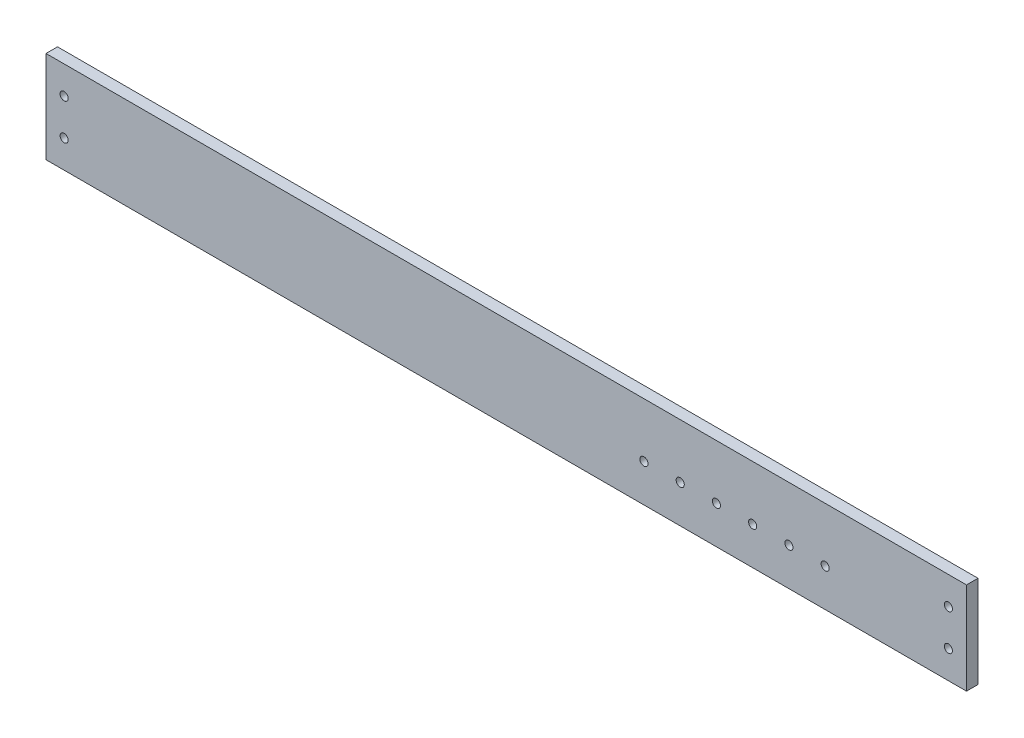
ISO-10303-21;
HEADER;
FILE_DESCRIPTION(('STEP AP214'),'2;1');
FILE_NAME('part.step','',(''),(''),'','','');
FILE_SCHEMA(('AUTOMOTIVE_DESIGN { 1 0 10303 214 1 1 1 1 }'));
ENDSEC;
DATA;
#1=APPLICATION_CONTEXT('core data for automotive mechanical design processes');
#2=APPLICATION_PROTOCOL_DEFINITION('international standard','automotive_design',2000,#1);
#3=PRODUCT_CONTEXT('',#1,'mechanical');
#4=PRODUCT('Part','Part','',(#3));
#5=PRODUCT_RELATED_PRODUCT_CATEGORY('part','',(#4));
#6=PRODUCT_DEFINITION_FORMATION('','',#4);
#7=PRODUCT_DEFINITION_CONTEXT('part definition',#1,'design');
#8=PRODUCT_DEFINITION('design','',#6,#7);
#9=PRODUCT_DEFINITION_SHAPE('','',#8);
#10=(LENGTH_UNIT() NAMED_UNIT(*) SI_UNIT(.MILLI.,.METRE.));
#11=(NAMED_UNIT(*) PLANE_ANGLE_UNIT() SI_UNIT($,.RADIAN.));
#12=(NAMED_UNIT(*) SI_UNIT($,.STERADIAN.) SOLID_ANGLE_UNIT());
#13=UNCERTAINTY_MEASURE_WITH_UNIT(LENGTH_MEASURE(1.E-05),#10,'distance_accuracy_value','');
#14=(GEOMETRIC_REPRESENTATION_CONTEXT(3) GLOBAL_UNCERTAINTY_ASSIGNED_CONTEXT((#13)) GLOBAL_UNIT_ASSIGNED_CONTEXT((#10,
#11,#12)) REPRESENTATION_CONTEXT('',''));
#15=CARTESIAN_POINT('',(0.,0.,0.));
#16=DIRECTION('',(0.,0.,1.));
#17=DIRECTION('',(1.,0.,0.));
#18=AXIS2_PLACEMENT_3D('',#15,#16,#17);
#19=CARTESIAN_POINT('',(0.,0.,3.175));
#20=DIRECTION('',(0.,0.,-1.));
#21=DIRECTION('',(-1.,0.,0.));
#22=AXIS2_PLACEMENT_3D('',#19,#20,#21);
#23=PLANE('',#22);
#24=DIRECTION('',(-1.,0.,0.));
#25=VECTOR('',#24,1.);
#26=CARTESIAN_POINT('',(-144.549090909091,66.7327272727273,3.175));
#27=LINE('',#26,#25);
#28=CARTESIAN_POINT('',(109.450909090909,66.7327272727274,3.175));
#29=VERTEX_POINT('',#28);
#30=CARTESIAN_POINT('',(-144.549090909091,66.7327272727273,3.175));
#31=VERTEX_POINT('',#30);
#32=EDGE_CURVE('E85',#29,#31,#27,.T.);
#33=ORIENTED_EDGE('',*,*,#32,.T.);
#34=DIRECTION('',(0.,-1.,0.));
#35=VECTOR('',#34,1.);
#36=CARTESIAN_POINT('',(-144.549090909091,66.7327272727273,3.175));
#37=LINE('',#36,#35);
#38=CARTESIAN_POINT('',(-144.549090909091,41.3327272727273,3.175));
#39=VERTEX_POINT('',#38);
#40=EDGE_CURVE('E80',#31,#39,#37,.T.);
#41=ORIENTED_EDGE('',*,*,#40,.T.);
#42=DIRECTION('',(1.,0.,0.));
#43=VECTOR('',#42,1.);
#44=CARTESIAN_POINT('',(-144.549090909091,41.3327272727273,3.175));
#45=LINE('',#44,#43);
#46=CARTESIAN_POINT('',(109.450909090909,41.3327272727274,3.175));
#47=VERTEX_POINT('',#46);
#48=EDGE_CURVE('E83',#39,#47,#45,.T.);
#49=ORIENTED_EDGE('',*,*,#48,.T.);
#50=DIRECTION('',(0.,1.,0.));
#51=VECTOR('',#50,1.);
#52=CARTESIAN_POINT('',(109.450909090909,66.7327272727274,3.175));
#53=LINE('',#52,#51);
#54=EDGE_CURVE('E50',#47,#29,#53,.T.);
#55=ORIENTED_EDGE('',*,*,#54,.T.);
#56=EDGE_LOOP('',(#33,#41,#49,#55));
#57=FACE_BOUND('',#56,.T.);
#58=CARTESIAN_POINT('',(-139.549090909091,59.0327272727273,3.175));
#59=DIRECTION('',(0.,0.,1.));
#60=DIRECTION('',(1.,0.,0.));
#61=AXIS2_PLACEMENT_3D('',#58,#59,#60);
#62=CIRCLE('',#61,1.12499999999998);
#63=CARTESIAN_POINT('',(-138.424090909091,59.0327272727273,3.175));
#64=VERTEX_POINT('',#63);
#65=EDGE_CURVE('E100',#64,#64,#62,.T.);
#66=ORIENTED_EDGE('',*,*,#65,.F.);
#67=EDGE_LOOP('',(#66));
#68=FACE_BOUND('',#67,.T.);
#69=CARTESIAN_POINT('',(-139.549090909091,49.0327272727273,3.175));
#70=DIRECTION('',(0.,0.,1.));
#71=DIRECTION('',(1.,0.,0.));
#72=AXIS2_PLACEMENT_3D('',#69,#70,#71);
#73=CIRCLE('',#72,1.12499999999998);
#74=CARTESIAN_POINT('',(-138.424090909091,49.0327272727273,3.175));
#75=VERTEX_POINT('',#74);
#76=EDGE_CURVE('E115',#75,#75,#73,.T.);
#77=ORIENTED_EDGE('',*,*,#76,.F.);
#78=EDGE_LOOP('',(#77));
#79=FACE_BOUND('',#78,.T.);
#80=CARTESIAN_POINT('',(104.450909090909,59.0327272727273,3.175));
#81=DIRECTION('',(0.,0.,1.));
#82=DIRECTION('',(1.,0.,0.));
#83=AXIS2_PLACEMENT_3D('',#80,#81,#82);
#84=CIRCLE('',#83,1.12499999999999);
#85=CARTESIAN_POINT('',(105.575909090909,59.0327272727273,3.175));
#86=VERTEX_POINT('',#85);
#87=EDGE_CURVE('E121',#86,#86,#84,.T.);
#88=ORIENTED_EDGE('',*,*,#87,.F.);
#89=EDGE_LOOP('',(#88));
#90=FACE_BOUND('',#89,.T.);
#91=CARTESIAN_POINT('',(104.450909090909,49.0327272727273,3.175));
#92=DIRECTION('',(0.,0.,1.));
#93=DIRECTION('',(1.,0.,0.));
#94=AXIS2_PLACEMENT_3D('',#91,#92,#93);
#95=CIRCLE('',#94,1.125);
#96=CARTESIAN_POINT('',(105.575909090909,49.0327272727273,3.175));
#97=VERTEX_POINT('',#96);
#98=EDGE_CURVE('E127',#97,#97,#95,.T.);
#99=ORIENTED_EDGE('',*,*,#98,.F.);
#100=EDGE_LOOP('',(#99));
#101=FACE_BOUND('',#100,.T.);
#102=CARTESIAN_POINT('',(20.450909090909,51.7327272727274,3.175));
#103=DIRECTION('',(0.,0.,1.));
#104=DIRECTION('',(1.,0.,0.));
#105=AXIS2_PLACEMENT_3D('',#102,#103,#104);
#106=CIRCLE('',#105,1.125);
#107=CARTESIAN_POINT('',(21.575909090909,51.7327272727274,3.175));
#108=VERTEX_POINT('',#107);
#109=EDGE_CURVE('E133',#108,#108,#106,.T.);
#110=ORIENTED_EDGE('',*,*,#109,.F.);
#111=EDGE_LOOP('',(#110));
#112=FACE_BOUND('',#111,.T.);
#113=CARTESIAN_POINT('',(30.4509090909089,51.7327272727274,3.175));
#114=DIRECTION('',(0.,0.,1.));
#115=DIRECTION('',(1.,0.,0.));
#116=AXIS2_PLACEMENT_3D('',#113,#114,#115);
#117=CIRCLE('',#116,1.125);
#118=CARTESIAN_POINT('',(31.575909090909,51.7327272727274,3.175));
#119=VERTEX_POINT('',#118);
#120=EDGE_CURVE('E139',#119,#119,#117,.T.);
#121=ORIENTED_EDGE('',*,*,#120,.F.);
#122=EDGE_LOOP('',(#121));
#123=FACE_BOUND('',#122,.T.);
#124=CARTESIAN_POINT('',(40.4509090909089,51.7327272727274,3.175));
#125=DIRECTION('',(0.,0.,1.));
#126=DIRECTION('',(1.,0.,0.));
#127=AXIS2_PLACEMENT_3D('',#124,#125,#126);
#128=CIRCLE('',#127,1.125);
#129=CARTESIAN_POINT('',(41.5759090909089,51.7327272727274,3.175));
#130=VERTEX_POINT('',#129);
#131=EDGE_CURVE('E145',#130,#130,#128,.T.);
#132=ORIENTED_EDGE('',*,*,#131,.F.);
#133=EDGE_LOOP('',(#132));
#134=FACE_BOUND('',#133,.T.);
#135=CARTESIAN_POINT('',(50.4509090909089,51.7327272727274,3.175));
#136=DIRECTION('',(0.,0.,1.));
#137=DIRECTION('',(1.,0.,0.));
#138=AXIS2_PLACEMENT_3D('',#135,#136,#137);
#139=CIRCLE('',#138,1.125);
#140=CARTESIAN_POINT('',(51.5759090909089,51.7327272727274,3.175));
#141=VERTEX_POINT('',#140);
#142=EDGE_CURVE('E151',#141,#141,#139,.T.);
#143=ORIENTED_EDGE('',*,*,#142,.F.);
#144=EDGE_LOOP('',(#143));
#145=FACE_BOUND('',#144,.T.);
#146=CARTESIAN_POINT('',(60.4509090909089,51.7327272727274,3.175));
#147=DIRECTION('',(0.,0.,1.));
#148=DIRECTION('',(1.,0.,0.));
#149=AXIS2_PLACEMENT_3D('',#146,#147,#148);
#150=CIRCLE('',#149,1.125);
#151=CARTESIAN_POINT('',(61.5759090909089,51.7327272727274,3.175));
#152=VERTEX_POINT('',#151);
#153=EDGE_CURVE('E157',#152,#152,#150,.T.);
#154=ORIENTED_EDGE('',*,*,#153,.F.);
#155=EDGE_LOOP('',(#154));
#156=FACE_BOUND('',#155,.T.);
#157=CARTESIAN_POINT('',(70.4509090909089,51.7327272727274,3.175));
#158=DIRECTION('',(0.,0.,1.));
#159=DIRECTION('',(1.,0.,0.));
#160=AXIS2_PLACEMENT_3D('',#157,#158,#159);
#161=CIRCLE('',#160,1.125);
#162=CARTESIAN_POINT('',(71.5759090909089,51.7327272727274,3.175));
#163=VERTEX_POINT('',#162);
#164=EDGE_CURVE('E163',#163,#163,#161,.T.);
#165=ORIENTED_EDGE('',*,*,#164,.F.);
#166=EDGE_LOOP('',(#165));
#167=FACE_BOUND('',#166,.T.);
#168=ADVANCED_FACE('F33',(#57,#68,#79,#90,#101,#112,#123,#134,#145,#156,#167),#23,.F.);
#169=CARTESIAN_POINT('',(0.,0.,0.));
#170=DIRECTION('',(0.,0.,-1.));
#171=DIRECTION('',(-1.,0.,0.));
#172=AXIS2_PLACEMENT_3D('',#169,#170,#171);
#173=PLANE('',#172);
#174=CARTESIAN_POINT('',(60.4509090909089,51.7327272727274,0.));
#175=DIRECTION('',(0.,0.,1.));
#176=DIRECTION('',(1.,0.,0.));
#177=AXIS2_PLACEMENT_3D('',#174,#175,#176);
#178=CIRCLE('',#177,1.125);
#179=CARTESIAN_POINT('',(61.5759090909089,51.7327272727274,0.));
#180=VERTEX_POINT('',#179);
#181=EDGE_CURVE('E160',#180,#180,#178,.T.);
#182=ORIENTED_EDGE('',*,*,#181,.T.);
#183=EDGE_LOOP('',(#182));
#184=FACE_BOUND('',#183,.T.);
#185=CARTESIAN_POINT('',(40.4509090909089,51.7327272727274,0.));
#186=DIRECTION('',(0.,0.,1.));
#187=DIRECTION('',(1.,0.,0.));
#188=AXIS2_PLACEMENT_3D('',#185,#186,#187);
#189=CIRCLE('',#188,1.125);
#190=CARTESIAN_POINT('',(41.5759090909089,51.7327272727274,0.));
#191=VERTEX_POINT('',#190);
#192=EDGE_CURVE('E148',#191,#191,#189,.T.);
#193=ORIENTED_EDGE('',*,*,#192,.T.);
#194=EDGE_LOOP('',(#193));
#195=FACE_BOUND('',#194,.T.);
#196=CARTESIAN_POINT('',(20.450909090909,51.7327272727274,0.));
#197=DIRECTION('',(0.,0.,1.));
#198=DIRECTION('',(1.,0.,0.));
#199=AXIS2_PLACEMENT_3D('',#196,#197,#198);
#200=CIRCLE('',#199,1.125);
#201=CARTESIAN_POINT('',(21.575909090909,51.7327272727274,0.));
#202=VERTEX_POINT('',#201);
#203=EDGE_CURVE('E136',#202,#202,#200,.T.);
#204=ORIENTED_EDGE('',*,*,#203,.T.);
#205=EDGE_LOOP('',(#204));
#206=FACE_BOUND('',#205,.T.);
#207=CARTESIAN_POINT('',(104.450909090909,59.0327272727273,0.));
#208=DIRECTION('',(0.,0.,1.));
#209=DIRECTION('',(1.,0.,0.));
#210=AXIS2_PLACEMENT_3D('',#207,#208,#209);
#211=CIRCLE('',#210,1.12499999999999);
#212=CARTESIAN_POINT('',(105.575909090909,59.0327272727273,0.));
#213=VERTEX_POINT('',#212);
#214=EDGE_CURVE('E124',#213,#213,#211,.T.);
#215=ORIENTED_EDGE('',*,*,#214,.T.);
#216=EDGE_LOOP('',(#215));
#217=FACE_BOUND('',#216,.T.);
#218=CARTESIAN_POINT('',(-139.549090909091,59.0327272727273,0.));
#219=DIRECTION('',(0.,0.,1.));
#220=DIRECTION('',(1.,0.,0.));
#221=AXIS2_PLACEMENT_3D('',#218,#219,#220);
#222=CIRCLE('',#221,1.12499999999998);
#223=CARTESIAN_POINT('',(-138.424090909091,59.0327272727273,0.));
#224=VERTEX_POINT('',#223);
#225=EDGE_CURVE('E112',#224,#224,#222,.T.);
#226=ORIENTED_EDGE('',*,*,#225,.T.);
#227=EDGE_LOOP('',(#226));
#228=FACE_BOUND('',#227,.T.);
#229=DIRECTION('',(-1.,0.,0.));
#230=VECTOR('',#229,1.);
#231=CARTESIAN_POINT('',(-144.549090909091,66.7327272727273,0.));
#232=LINE('',#231,#230);
#233=CARTESIAN_POINT('',(109.450909090909,66.7327272727274,0.));
#234=VERTEX_POINT('',#233);
#235=CARTESIAN_POINT('',(-144.549090909091,66.7327272727273,0.));
#236=VERTEX_POINT('',#235);
#237=EDGE_CURVE('E97',#234,#236,#232,.T.);
#238=ORIENTED_EDGE('',*,*,#237,.F.);
#239=DIRECTION('',(0.,1.,0.));
#240=VECTOR('',#239,1.);
#241=CARTESIAN_POINT('',(109.450909090909,66.7327272727274,0.));
#242=LINE('',#241,#240);
#243=CARTESIAN_POINT('',(109.450909090909,41.3327272727274,0.));
#244=VERTEX_POINT('',#243);
#245=EDGE_CURVE('E73',#244,#234,#242,.T.);
#246=ORIENTED_EDGE('',*,*,#245,.F.);
#247=DIRECTION('',(1.,0.,0.));
#248=VECTOR('',#247,1.);
#249=CARTESIAN_POINT('',(-144.549090909091,41.3327272727273,0.));
#250=LINE('',#249,#248);
#251=CARTESIAN_POINT('',(-144.549090909091,41.3327272727273,0.));
#252=VERTEX_POINT('',#251);
#253=EDGE_CURVE('E67',#252,#244,#250,.T.);
#254=ORIENTED_EDGE('',*,*,#253,.F.);
#255=DIRECTION('',(0.,-1.,0.));
#256=VECTOR('',#255,1.);
#257=CARTESIAN_POINT('',(-144.549090909091,66.7327272727273,0.));
#258=LINE('',#257,#256);
#259=EDGE_CURVE('E89',#236,#252,#258,.T.);
#260=ORIENTED_EDGE('',*,*,#259,.F.);
#261=EDGE_LOOP('',(#238,#246,#254,#260));
#262=FACE_BOUND('',#261,.T.);
#263=CARTESIAN_POINT('',(-139.549090909091,49.0327272727273,0.));
#264=DIRECTION('',(0.,0.,1.));
#265=DIRECTION('',(1.,0.,0.));
#266=AXIS2_PLACEMENT_3D('',#263,#264,#265);
#267=CIRCLE('',#266,1.12499999999998);
#268=CARTESIAN_POINT('',(-138.424090909091,49.0327272727273,0.));
#269=VERTEX_POINT('',#268);
#270=EDGE_CURVE('E118',#269,#269,#267,.T.);
#271=ORIENTED_EDGE('',*,*,#270,.T.);
#272=EDGE_LOOP('',(#271));
#273=FACE_BOUND('',#272,.T.);
#274=CARTESIAN_POINT('',(104.450909090909,49.0327272727273,0.));
#275=DIRECTION('',(0.,0.,1.));
#276=DIRECTION('',(1.,0.,0.));
#277=AXIS2_PLACEMENT_3D('',#274,#275,#276);
#278=CIRCLE('',#277,1.125);
#279=CARTESIAN_POINT('',(105.575909090909,49.0327272727273,0.));
#280=VERTEX_POINT('',#279);
#281=EDGE_CURVE('E130',#280,#280,#278,.T.);
#282=ORIENTED_EDGE('',*,*,#281,.T.);
#283=EDGE_LOOP('',(#282));
#284=FACE_BOUND('',#283,.T.);
#285=CARTESIAN_POINT('',(30.4509090909089,51.7327272727274,0.));
#286=DIRECTION('',(0.,0.,1.));
#287=DIRECTION('',(1.,0.,0.));
#288=AXIS2_PLACEMENT_3D('',#285,#286,#287);
#289=CIRCLE('',#288,1.125);
#290=CARTESIAN_POINT('',(31.575909090909,51.7327272727274,0.));
#291=VERTEX_POINT('',#290);
#292=EDGE_CURVE('E142',#291,#291,#289,.T.);
#293=ORIENTED_EDGE('',*,*,#292,.T.);
#294=EDGE_LOOP('',(#293));
#295=FACE_BOUND('',#294,.T.);
#296=CARTESIAN_POINT('',(50.4509090909089,51.7327272727274,0.));
#297=DIRECTION('',(0.,0.,1.));
#298=DIRECTION('',(1.,0.,0.));
#299=AXIS2_PLACEMENT_3D('',#296,#297,#298);
#300=CIRCLE('',#299,1.125);
#301=CARTESIAN_POINT('',(51.5759090909089,51.7327272727274,0.));
#302=VERTEX_POINT('',#301);
#303=EDGE_CURVE('E154',#302,#302,#300,.T.);
#304=ORIENTED_EDGE('',*,*,#303,.T.);
#305=EDGE_LOOP('',(#304));
#306=FACE_BOUND('',#305,.T.);
#307=CARTESIAN_POINT('',(70.4509090909089,51.7327272727274,0.));
#308=DIRECTION('',(0.,0.,1.));
#309=DIRECTION('',(1.,0.,0.));
#310=AXIS2_PLACEMENT_3D('',#307,#308,#309);
#311=CIRCLE('',#310,1.125);
#312=CARTESIAN_POINT('',(71.5759090909089,51.7327272727274,0.));
#313=VERTEX_POINT('',#312);
#314=EDGE_CURVE('E166',#313,#313,#311,.T.);
#315=ORIENTED_EDGE('',*,*,#314,.T.);
#316=EDGE_LOOP('',(#315));
#317=FACE_BOUND('',#316,.T.);
#318=ADVANCED_FACE('F108',(#184,#195,#206,#217,#228,#262,#273,#284,#295,#306,#317),#173,.T.);
#319=CARTESIAN_POINT('',(-144.549090909091,66.7327272727273,3.175));
#320=DIRECTION('',(0.,-1.,0.));
#321=DIRECTION('',(1.,0.,0.));
#322=AXIS2_PLACEMENT_3D('',#319,#320,#321);
#323=PLANE('',#322);
#324=ORIENTED_EDGE('',*,*,#237,.T.);
#325=DIRECTION('',(0.,0.,-1.));
#326=VECTOR('',#325,1.);
#327=CARTESIAN_POINT('',(-144.549090909091,66.7327272727273,3.175));
#328=LINE('',#327,#326);
#329=EDGE_CURVE('E11',#31,#236,#328,.T.);
#330=ORIENTED_EDGE('',*,*,#329,.F.);
#331=ORIENTED_EDGE('',*,*,#32,.F.);
#332=DIRECTION('',(0.,0.,-1.));
#333=VECTOR('',#332,1.);
#334=CARTESIAN_POINT('',(109.450909090909,66.7327272727274,3.175));
#335=LINE('',#334,#333);
#336=EDGE_CURVE('E93',#29,#234,#335,.T.);
#337=ORIENTED_EDGE('',*,*,#336,.T.);
#338=EDGE_LOOP('',(#324,#330,#331,#337));
#339=FACE_BOUND('',#338,.T.);
#340=ADVANCED_FACE('F35',(#339),#323,.F.);
#341=CARTESIAN_POINT('',(-144.549090909091,66.7327272727273,3.175));
#342=DIRECTION('',(1.,0.,0.));
#343=DIRECTION('',(0.,0.,-1.));
#344=AXIS2_PLACEMENT_3D('',#341,#342,#343);
#345=PLANE('',#344);
#346=ORIENTED_EDGE('',*,*,#259,.T.);
#347=DIRECTION('',(0.,0.,-1.));
#348=VECTOR('',#347,1.);
#349=CARTESIAN_POINT('',(-144.549090909091,41.3327272727273,3.175));
#350=LINE('',#349,#348);
#351=EDGE_CURVE('E42',#39,#252,#350,.T.);
#352=ORIENTED_EDGE('',*,*,#351,.F.);
#353=ORIENTED_EDGE('',*,*,#40,.F.);
#354=ORIENTED_EDGE('',*,*,#329,.T.);
#355=EDGE_LOOP('',(#346,#352,#353,#354));
#356=FACE_BOUND('',#355,.T.);
#357=ADVANCED_FACE('F88',(#356),#345,.F.);
#358=CARTESIAN_POINT('',(-144.549090909091,41.3327272727273,3.175));
#359=DIRECTION('',(0.,1.,0.));
#360=DIRECTION('',(-1.,0.,0.));
#361=AXIS2_PLACEMENT_3D('',#358,#359,#360);
#362=PLANE('',#361);
#363=ORIENTED_EDGE('',*,*,#253,.T.);
#364=DIRECTION('',(0.,0.,-1.));
#365=VECTOR('',#364,1.);
#366=CARTESIAN_POINT('',(109.450909090909,41.3327272727274,3.175));
#367=LINE('',#366,#365);
#368=EDGE_CURVE('E90',#47,#244,#367,.T.);
#369=ORIENTED_EDGE('',*,*,#368,.F.);
#370=ORIENTED_EDGE('',*,*,#48,.F.);
#371=ORIENTED_EDGE('',*,*,#351,.T.);
#372=EDGE_LOOP('',(#363,#369,#370,#371));
#373=FACE_BOUND('',#372,.T.);
#374=ADVANCED_FACE('F91',(#373),#362,.F.);
#375=CARTESIAN_POINT('',(109.450909090909,66.7327272727274,3.175));
#376=DIRECTION('',(-1.,0.,0.));
#377=DIRECTION('',(0.,0.,1.));
#378=AXIS2_PLACEMENT_3D('',#375,#376,#377);
#379=PLANE('',#378);
#380=ORIENTED_EDGE('',*,*,#245,.T.);
#381=ORIENTED_EDGE('',*,*,#336,.F.);
#382=ORIENTED_EDGE('',*,*,#54,.F.);
#383=ORIENTED_EDGE('',*,*,#368,.T.);
#384=EDGE_LOOP('',(#380,#381,#382,#383));
#385=FACE_BOUND('',#384,.T.);
#386=ADVANCED_FACE('F105',(#385),#379,.F.);
#387=CARTESIAN_POINT('',(-139.549090909091,59.0327272727273,3.175));
#388=DIRECTION('',(0.,0.,-1.));
#389=DIRECTION('',(-1.,0.,0.));
#390=AXIS2_PLACEMENT_3D('',#387,#388,#389);
#391=CYLINDRICAL_SURFACE('',#390,1.12499999999998);
#392=ORIENTED_EDGE('',*,*,#65,.T.);
#393=EDGE_LOOP('',(#392));
#394=FACE_BOUND('',#393,.T.);
#395=ORIENTED_EDGE('',*,*,#225,.F.);
#396=EDGE_LOOP('',(#395));
#397=FACE_BOUND('',#396,.T.);
#398=ADVANCED_FACE('F183',(#394,#397),#391,.F.);
#399=CARTESIAN_POINT('',(-139.549090909091,49.0327272727273,3.175));
#400=DIRECTION('',(0.,0.,-1.));
#401=DIRECTION('',(-1.,0.,0.));
#402=AXIS2_PLACEMENT_3D('',#399,#400,#401);
#403=CYLINDRICAL_SURFACE('',#402,1.12499999999998);
#404=ORIENTED_EDGE('',*,*,#76,.T.);
#405=EDGE_LOOP('',(#404));
#406=FACE_BOUND('',#405,.T.);
#407=ORIENTED_EDGE('',*,*,#270,.F.);
#408=EDGE_LOOP('',(#407));
#409=FACE_BOUND('',#408,.T.);
#410=ADVANCED_FACE('F229',(#406,#409),#403,.F.);
#411=CARTESIAN_POINT('',(104.450909090909,59.0327272727273,3.175));
#412=DIRECTION('',(0.,0.,-1.));
#413=DIRECTION('',(-1.,0.,0.));
#414=AXIS2_PLACEMENT_3D('',#411,#412,#413);
#415=CYLINDRICAL_SURFACE('',#414,1.12499999999999);
#416=ORIENTED_EDGE('',*,*,#87,.T.);
#417=EDGE_LOOP('',(#416));
#418=FACE_BOUND('',#417,.T.);
#419=ORIENTED_EDGE('',*,*,#214,.F.);
#420=EDGE_LOOP('',(#419));
#421=FACE_BOUND('',#420,.T.);
#422=ADVANCED_FACE('F237',(#418,#421),#415,.F.);
#423=CARTESIAN_POINT('',(104.450909090909,49.0327272727273,3.175));
#424=DIRECTION('',(0.,0.,-1.));
#425=DIRECTION('',(-1.,0.,0.));
#426=AXIS2_PLACEMENT_3D('',#423,#424,#425);
#427=CYLINDRICAL_SURFACE('',#426,1.125);
#428=ORIENTED_EDGE('',*,*,#98,.T.);
#429=EDGE_LOOP('',(#428));
#430=FACE_BOUND('',#429,.T.);
#431=ORIENTED_EDGE('',*,*,#281,.F.);
#432=EDGE_LOOP('',(#431));
#433=FACE_BOUND('',#432,.T.);
#434=ADVANCED_FACE('F245',(#430,#433),#427,.F.);
#435=CARTESIAN_POINT('',(20.450909090909,51.7327272727274,3.175));
#436=DIRECTION('',(0.,0.,-1.));
#437=DIRECTION('',(-1.,0.,0.));
#438=AXIS2_PLACEMENT_3D('',#435,#436,#437);
#439=CYLINDRICAL_SURFACE('',#438,1.125);
#440=ORIENTED_EDGE('',*,*,#109,.T.);
#441=EDGE_LOOP('',(#440));
#442=FACE_BOUND('',#441,.T.);
#443=ORIENTED_EDGE('',*,*,#203,.F.);
#444=EDGE_LOOP('',(#443));
#445=FACE_BOUND('',#444,.T.);
#446=ADVANCED_FACE('F254',(#442,#445),#439,.F.);
#447=CARTESIAN_POINT('',(30.4509090909089,51.7327272727274,3.175));
#448=DIRECTION('',(0.,0.,-1.));
#449=DIRECTION('',(-1.,0.,0.));
#450=AXIS2_PLACEMENT_3D('',#447,#448,#449);
#451=CYLINDRICAL_SURFACE('',#450,1.125);
#452=ORIENTED_EDGE('',*,*,#120,.T.);
#453=EDGE_LOOP('',(#452));
#454=FACE_BOUND('',#453,.T.);
#455=ORIENTED_EDGE('',*,*,#292,.F.);
#456=EDGE_LOOP('',(#455));
#457=FACE_BOUND('',#456,.T.);
#458=ADVANCED_FACE('F263',(#454,#457),#451,.F.);
#459=CARTESIAN_POINT('',(40.4509090909089,51.7327272727274,3.175));
#460=DIRECTION('',(0.,0.,-1.));
#461=DIRECTION('',(-1.,0.,0.));
#462=AXIS2_PLACEMENT_3D('',#459,#460,#461);
#463=CYLINDRICAL_SURFACE('',#462,1.125);
#464=ORIENTED_EDGE('',*,*,#131,.T.);
#465=EDGE_LOOP('',(#464));
#466=FACE_BOUND('',#465,.T.);
#467=ORIENTED_EDGE('',*,*,#192,.F.);
#468=EDGE_LOOP('',(#467));
#469=FACE_BOUND('',#468,.T.);
#470=ADVANCED_FACE('F272',(#466,#469),#463,.F.);
#471=CARTESIAN_POINT('',(50.4509090909089,51.7327272727274,3.175));
#472=DIRECTION('',(0.,0.,-1.));
#473=DIRECTION('',(-1.,0.,0.));
#474=AXIS2_PLACEMENT_3D('',#471,#472,#473);
#475=CYLINDRICAL_SURFACE('',#474,1.125);
#476=ORIENTED_EDGE('',*,*,#142,.T.);
#477=EDGE_LOOP('',(#476));
#478=FACE_BOUND('',#477,.T.);
#479=ORIENTED_EDGE('',*,*,#303,.F.);
#480=EDGE_LOOP('',(#479));
#481=FACE_BOUND('',#480,.T.);
#482=ADVANCED_FACE('F281',(#478,#481),#475,.F.);
#483=CARTESIAN_POINT('',(60.4509090909089,51.7327272727274,3.175));
#484=DIRECTION('',(0.,0.,-1.));
#485=DIRECTION('',(-1.,0.,0.));
#486=AXIS2_PLACEMENT_3D('',#483,#484,#485);
#487=CYLINDRICAL_SURFACE('',#486,1.125);
#488=ORIENTED_EDGE('',*,*,#153,.T.);
#489=EDGE_LOOP('',(#488));
#490=FACE_BOUND('',#489,.T.);
#491=ORIENTED_EDGE('',*,*,#181,.F.);
#492=EDGE_LOOP('',(#491));
#493=FACE_BOUND('',#492,.T.);
#494=ADVANCED_FACE('F290',(#490,#493),#487,.F.);
#495=CARTESIAN_POINT('',(70.4509090909089,51.7327272727274,3.175));
#496=DIRECTION('',(0.,0.,-1.));
#497=DIRECTION('',(-1.,0.,0.));
#498=AXIS2_PLACEMENT_3D('',#495,#496,#497);
#499=CYLINDRICAL_SURFACE('',#498,1.125);
#500=ORIENTED_EDGE('',*,*,#164,.T.);
#501=EDGE_LOOP('',(#500));
#502=FACE_BOUND('',#501,.T.);
#503=ORIENTED_EDGE('',*,*,#314,.F.);
#504=EDGE_LOOP('',(#503));
#505=FACE_BOUND('',#504,.T.);
#506=ADVANCED_FACE('F172',(#502,#505),#499,.F.);
#507=CLOSED_SHELL('',(#168,#318,#340,#357,#374,#386,#398,#410,#422,#434,#446,#458,#470,#482,
#494,#506));
#508=MANIFOLD_SOLID_BREP('B2',#507);
#509=ADVANCED_BREP_SHAPE_REPRESENTATION('',(#18,#508),#14);
#510=SHAPE_DEFINITION_REPRESENTATION(#9,#509);
ENDSEC;
END-ISO-10303-21;
